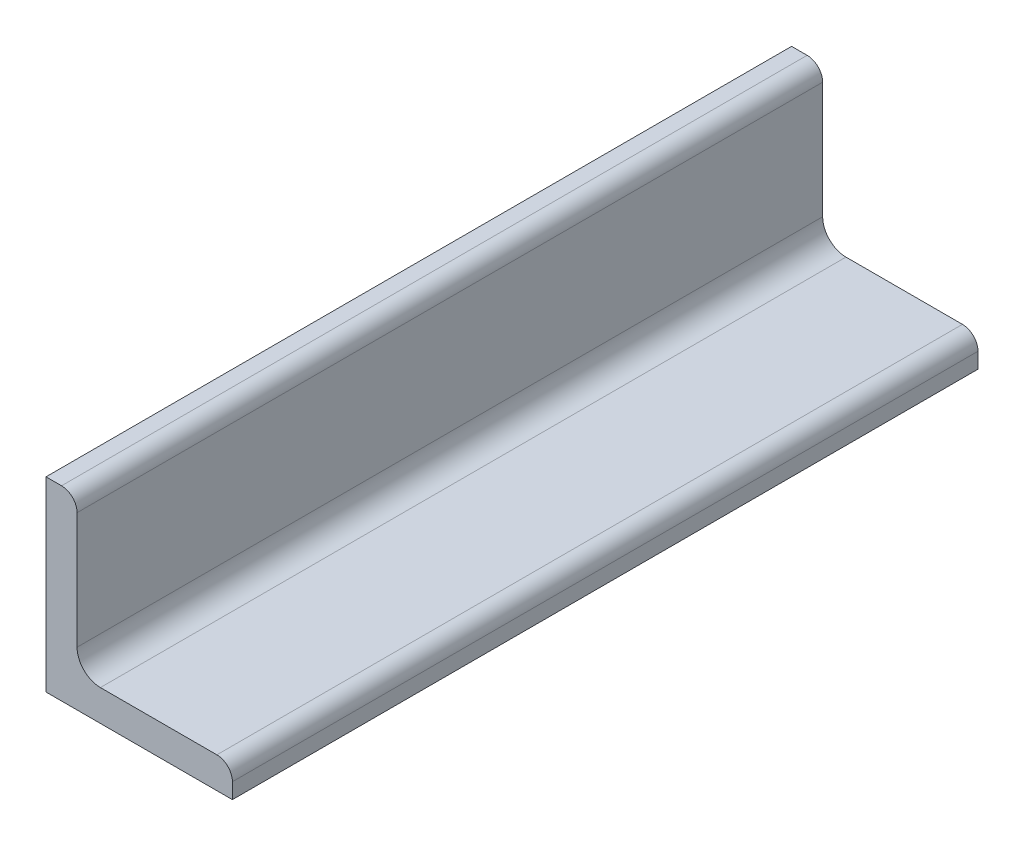
ISO-10303-21;
HEADER;
FILE_DESCRIPTION(('STEP AP214'),'2;1');
FILE_NAME('part.step','',(''),(''),'','','');
FILE_SCHEMA(('AUTOMOTIVE_DESIGN { 1 0 10303 214 1 1 1 1 }'));
ENDSEC;
DATA;
#1=APPLICATION_CONTEXT('core data for automotive mechanical design processes');
#2=APPLICATION_PROTOCOL_DEFINITION('international standard','automotive_design',2000,#1);
#3=PRODUCT_CONTEXT('',#1,'mechanical');
#4=PRODUCT('Part','Part','',(#3));
#5=PRODUCT_RELATED_PRODUCT_CATEGORY('part','',(#4));
#6=PRODUCT_DEFINITION_FORMATION('','',#4);
#7=PRODUCT_DEFINITION_CONTEXT('part definition',#1,'design');
#8=PRODUCT_DEFINITION('design','',#6,#7);
#9=PRODUCT_DEFINITION_SHAPE('','',#8);
#10=(LENGTH_UNIT() NAMED_UNIT(*) SI_UNIT(.MILLI.,.METRE.));
#11=(NAMED_UNIT(*) PLANE_ANGLE_UNIT() SI_UNIT($,.RADIAN.));
#12=(NAMED_UNIT(*) SI_UNIT($,.STERADIAN.) SOLID_ANGLE_UNIT());
#13=UNCERTAINTY_MEASURE_WITH_UNIT(LENGTH_MEASURE(1.E-05),#10,'distance_accuracy_value','');
#14=(GEOMETRIC_REPRESENTATION_CONTEXT(3) GLOBAL_UNCERTAINTY_ASSIGNED_CONTEXT((#13)) GLOBAL_UNIT_ASSIGNED_CONTEXT((#10,
#11,#12)) REPRESENTATION_CONTEXT('',''));
#15=CARTESIAN_POINT('',(0.,0.,0.));
#16=DIRECTION('',(0.,0.,1.));
#17=DIRECTION('',(1.,0.,0.));
#18=AXIS2_PLACEMENT_3D('',#15,#16,#17);
#19=CARTESIAN_POINT('',(0.490776827053332,76.2882459217981,304.8));
#20=DIRECTION('',(1.,0.,0.));
#21=DIRECTION('',(0.,0.,-1.));
#22=AXIS2_PLACEMENT_3D('',#19,#20,#21);
#23=PLANE('',#22);
#24=DIRECTION('',(0.,-1.,0.));
#25=VECTOR('',#24,1.);
#26=CARTESIAN_POINT('',(0.490776827053332,76.2882459217981,0.));
#27=LINE('',#26,#25);
#28=CARTESIAN_POINT('',(0.490776827053332,76.2882459217981,0.));
#29=VERTEX_POINT('',#28);
#30=CARTESIAN_POINT('',(0.490776827053332,0.0882459217980795,0.));
#31=VERTEX_POINT('',#30);
#32=EDGE_CURVE('E135',#29,#31,#27,.T.);
#33=ORIENTED_EDGE('',*,*,#32,.T.);
#34=DIRECTION('',(0.,0.,-1.));
#35=VECTOR('',#34,1.);
#36=CARTESIAN_POINT('',(0.490776827053332,0.0882459217980795,304.8));
#37=LINE('',#36,#35);
#38=CARTESIAN_POINT('',(0.490776827053332,0.0882459217980795,304.8));
#39=VERTEX_POINT('',#38);
#40=EDGE_CURVE('E11',#39,#31,#37,.T.);
#41=ORIENTED_EDGE('',*,*,#40,.F.);
#42=DIRECTION('',(0.,-1.,0.));
#43=VECTOR('',#42,1.);
#44=CARTESIAN_POINT('',(0.490776827053332,76.2882459217981,304.8));
#45=LINE('',#44,#43);
#46=CARTESIAN_POINT('',(0.490776827053332,76.2882459217981,304.8));
#47=VERTEX_POINT('',#46);
#48=EDGE_CURVE('E151',#47,#39,#45,.T.);
#49=ORIENTED_EDGE('',*,*,#48,.F.);
#50=DIRECTION('',(0.,0.,-1.));
#51=VECTOR('',#50,1.);
#52=CARTESIAN_POINT('',(0.490776827053332,76.2882459217981,304.8));
#53=LINE('',#52,#51);
#54=EDGE_CURVE('E131',#47,#29,#53,.T.);
#55=ORIENTED_EDGE('',*,*,#54,.T.);
#56=EDGE_LOOP('',(#33,#41,#49,#55));
#57=FACE_BOUND('',#56,.T.);
#58=ADVANCED_FACE('F33',(#57),#23,.F.);
#59=CARTESIAN_POINT('',(0.490776827053332,0.0882459217980795,304.8));
#60=DIRECTION('',(0.,1.,0.));
#61=DIRECTION('',(0.,0.,1.));
#62=AXIS2_PLACEMENT_3D('',#59,#60,#61);
#63=PLANE('',#62);
#64=DIRECTION('',(1.,0.,0.));
#65=VECTOR('',#64,1.);
#66=CARTESIAN_POINT('',(0.490776827053332,0.0882459217980795,0.));
#67=LINE('',#66,#65);
#68=CARTESIAN_POINT('',(76.6907768270533,0.0882459217980795,0.));
#69=VERTEX_POINT('',#68);
#70=EDGE_CURVE('E138',#31,#69,#67,.T.);
#71=ORIENTED_EDGE('',*,*,#70,.T.);
#72=DIRECTION('',(0.,0.,-1.));
#73=VECTOR('',#72,1.);
#74=CARTESIAN_POINT('',(76.6907768270533,0.0882459217980795,304.8));
#75=LINE('',#74,#73);
#76=CARTESIAN_POINT('',(76.6907768270533,0.0882459217980795,304.8));
#77=VERTEX_POINT('',#76);
#78=EDGE_CURVE('E41',#77,#69,#75,.T.);
#79=ORIENTED_EDGE('',*,*,#78,.F.);
#80=DIRECTION('',(1.,0.,0.));
#81=VECTOR('',#80,1.);
#82=CARTESIAN_POINT('',(0.490776827053332,0.0882459217980795,304.8));
#83=LINE('',#82,#81);
#84=EDGE_CURVE('E95',#39,#77,#83,.T.);
#85=ORIENTED_EDGE('',*,*,#84,.F.);
#86=ORIENTED_EDGE('',*,*,#40,.T.);
#87=EDGE_LOOP('',(#71,#79,#85,#86));
#88=FACE_BOUND('',#87,.T.);
#89=ADVANCED_FACE('F194',(#88),#63,.F.);
#90=CARTESIAN_POINT('',(76.6907768270533,0.0882459217980795,304.8));
#91=DIRECTION('',(-1.,0.,0.));
#92=DIRECTION('',(0.,0.,1.));
#93=AXIS2_PLACEMENT_3D('',#90,#91,#92);
#94=PLANE('',#93);
#95=DIRECTION('',(0.,1.,0.));
#96=VECTOR('',#95,1.);
#97=CARTESIAN_POINT('',(76.6907768270533,0.0882459217980795,0.));
#98=LINE('',#97,#96);
#99=CARTESIAN_POINT('',(76.6907768270533,6.43824592179808,0.));
#100=VERTEX_POINT('',#99);
#101=EDGE_CURVE('E140',#69,#100,#98,.T.);
#102=ORIENTED_EDGE('',*,*,#101,.T.);
#103=DIRECTION('',(0.,0.,-1.));
#104=VECTOR('',#103,1.);
#105=CARTESIAN_POINT('',(76.6907768270533,6.43824592179808,304.8));
#106=LINE('',#105,#104);
#107=CARTESIAN_POINT('',(76.6907768270533,6.43824592179808,304.8));
#108=VERTEX_POINT('',#107);
#109=EDGE_CURVE('E161',#108,#100,#106,.T.);
#110=ORIENTED_EDGE('',*,*,#109,.F.);
#111=DIRECTION('',(0.,1.,0.));
#112=VECTOR('',#111,1.);
#113=CARTESIAN_POINT('',(76.6907768270533,0.0882459217980795,304.8));
#114=LINE('',#113,#112);
#115=EDGE_CURVE('E169',#77,#108,#114,.T.);
#116=ORIENTED_EDGE('',*,*,#115,.F.);
#117=ORIENTED_EDGE('',*,*,#78,.T.);
#118=EDGE_LOOP('',(#102,#110,#116,#117));
#119=FACE_BOUND('',#118,.T.);
#120=ADVANCED_FACE('F167',(#119),#94,.F.);
#121=CARTESIAN_POINT('',(70.3407768270533,6.43824592179808,304.8));
#122=DIRECTION('',(0.,0.,-1.));
#123=DIRECTION('',(-1.,0.,0.));
#124=AXIS2_PLACEMENT_3D('',#121,#122,#123);
#125=CYLINDRICAL_SURFACE('',#124,6.35000000000001);
#126=CARTESIAN_POINT('',(70.3407768270533,6.43824592179808,0.));
#127=DIRECTION('',(0.,0.,1.));
#128=DIRECTION('',(1.,0.,0.));
#129=AXIS2_PLACEMENT_3D('',#126,#127,#128);
#130=CIRCLE('',#129,6.35000000000001);
#131=CARTESIAN_POINT('',(70.3407768270533,12.7882459217981,0.));
#132=VERTEX_POINT('',#131);
#133=EDGE_CURVE('E142',#100,#132,#130,.T.);
#134=ORIENTED_EDGE('',*,*,#133,.T.);
#135=DIRECTION('',(0.,0.,-1.));
#136=VECTOR('',#135,1.);
#137=CARTESIAN_POINT('',(70.3407768270533,12.7882459217981,304.8));
#138=LINE('',#137,#136);
#139=CARTESIAN_POINT('',(70.3407768270533,12.7882459217981,304.8));
#140=VERTEX_POINT('',#139);
#141=EDGE_CURVE('E158',#140,#132,#138,.T.);
#142=ORIENTED_EDGE('',*,*,#141,.F.);
#143=CARTESIAN_POINT('',(70.3407768270533,6.43824592179808,304.8));
#144=DIRECTION('',(0.,0.,1.));
#145=DIRECTION('',(1.,0.,0.));
#146=AXIS2_PLACEMENT_3D('',#143,#144,#145);
#147=CIRCLE('',#146,6.35000000000001);
#148=EDGE_CURVE('E185',#108,#140,#147,.T.);
#149=ORIENTED_EDGE('',*,*,#148,.F.);
#150=ORIENTED_EDGE('',*,*,#109,.T.);
#151=EDGE_LOOP('',(#134,#142,#149,#150));
#152=FACE_BOUND('',#151,.T.);
#153=ADVANCED_FACE('F178',(#152),#125,.T.);
#154=CARTESIAN_POINT('',(70.3407768270533,12.7882459217981,304.8));
#155=DIRECTION('',(0.,-1.,0.));
#156=DIRECTION('',(0.,0.,-1.));
#157=AXIS2_PLACEMENT_3D('',#154,#155,#156);
#158=PLANE('',#157);
#159=DIRECTION('',(-1.,0.,0.));
#160=VECTOR('',#159,1.);
#161=CARTESIAN_POINT('',(70.3407768270533,12.7882459217981,0.));
#162=LINE('',#161,#160);
#163=CARTESIAN_POINT('',(22.7157768270533,12.7882459217981,0.));
#164=VERTEX_POINT('',#163);
#165=EDGE_CURVE('E144',#132,#164,#162,.T.);
#166=ORIENTED_EDGE('',*,*,#165,.T.);
#167=DIRECTION('',(0.,0.,-1.));
#168=VECTOR('',#167,1.);
#169=CARTESIAN_POINT('',(22.7157768270533,12.7882459217981,304.8));
#170=LINE('',#169,#168);
#171=CARTESIAN_POINT('',(22.7157768270533,12.7882459217981,304.8));
#172=VERTEX_POINT('',#171);
#173=EDGE_CURVE('E155',#172,#164,#170,.T.);
#174=ORIENTED_EDGE('',*,*,#173,.F.);
#175=DIRECTION('',(-1.,0.,0.));
#176=VECTOR('',#175,1.);
#177=CARTESIAN_POINT('',(70.3407768270533,12.7882459217981,304.8));
#178=LINE('',#177,#176);
#179=EDGE_CURVE('E184',#140,#172,#178,.T.);
#180=ORIENTED_EDGE('',*,*,#179,.F.);
#181=ORIENTED_EDGE('',*,*,#141,.T.);
#182=EDGE_LOOP('',(#166,#174,#180,#181));
#183=FACE_BOUND('',#182,.T.);
#184=ADVANCED_FACE('F182',(#183),#158,.F.);
#185=CARTESIAN_POINT('',(22.7157768270533,22.3132459217981,304.8));
#186=DIRECTION('',(0.,0.,-1.));
#187=DIRECTION('',(-1.,0.,0.));
#188=AXIS2_PLACEMENT_3D('',#185,#186,#187);
#189=CYLINDRICAL_SURFACE('',#188,9.52499999999999);
#190=CARTESIAN_POINT('',(22.7157768270533,22.3132459217981,0.));
#191=DIRECTION('',(0.,0.,-1.));
#192=DIRECTION('',(1.,0.,0.));
#193=AXIS2_PLACEMENT_3D('',#190,#191,#192);
#194=CIRCLE('',#193,9.52499999999999);
#195=CARTESIAN_POINT('',(13.1907768270533,22.3132459217981,0.));
#196=VERTEX_POINT('',#195);
#197=EDGE_CURVE('E146',#164,#196,#194,.T.);
#198=ORIENTED_EDGE('',*,*,#197,.T.);
#199=DIRECTION('',(0.,0.,-1.));
#200=VECTOR('',#199,1.);
#201=CARTESIAN_POINT('',(13.1907768270533,22.3132459217981,304.8));
#202=LINE('',#201,#200);
#203=CARTESIAN_POINT('',(13.1907768270533,22.3132459217981,304.8));
#204=VERTEX_POINT('',#203);
#205=EDGE_CURVE('E126',#204,#196,#202,.T.);
#206=ORIENTED_EDGE('',*,*,#205,.F.);
#207=CARTESIAN_POINT('',(22.7157768270533,22.3132459217981,304.8));
#208=DIRECTION('',(0.,0.,-1.));
#209=DIRECTION('',(1.,0.,0.));
#210=AXIS2_PLACEMENT_3D('',#207,#208,#209);
#211=CIRCLE('',#210,9.52499999999999);
#212=EDGE_CURVE('E117',#172,#204,#211,.T.);
#213=ORIENTED_EDGE('',*,*,#212,.F.);
#214=ORIENTED_EDGE('',*,*,#173,.T.);
#215=EDGE_LOOP('',(#198,#206,#213,#214));
#216=FACE_BOUND('',#215,.T.);
#217=ADVANCED_FACE('F206',(#216),#189,.F.);
#218=CARTESIAN_POINT('',(13.1907768270533,22.3132459217981,304.8));
#219=DIRECTION('',(-1.,0.,0.));
#220=DIRECTION('',(0.,0.,1.));
#221=AXIS2_PLACEMENT_3D('',#218,#219,#220);
#222=PLANE('',#221);
#223=DIRECTION('',(0.,1.,0.));
#224=VECTOR('',#223,1.);
#225=CARTESIAN_POINT('',(13.1907768270533,22.3132459217981,0.));
#226=LINE('',#225,#224);
#227=CARTESIAN_POINT('',(13.1907768270533,69.9382459217981,0.));
#228=VERTEX_POINT('',#227);
#229=EDGE_CURVE('E125',#196,#228,#226,.T.);
#230=ORIENTED_EDGE('',*,*,#229,.T.);
#231=DIRECTION('',(0.,0.,-1.));
#232=VECTOR('',#231,1.);
#233=CARTESIAN_POINT('',(13.1907768270533,69.9382459217981,304.8));
#234=LINE('',#233,#232);
#235=CARTESIAN_POINT('',(13.1907768270533,69.9382459217981,304.8));
#236=VERTEX_POINT('',#235);
#237=EDGE_CURVE('E122',#236,#228,#234,.T.);
#238=ORIENTED_EDGE('',*,*,#237,.F.);
#239=DIRECTION('',(0.,1.,0.));
#240=VECTOR('',#239,1.);
#241=CARTESIAN_POINT('',(13.1907768270533,22.3132459217981,304.8));
#242=LINE('',#241,#240);
#243=EDGE_CURVE('E111',#204,#236,#242,.T.);
#244=ORIENTED_EDGE('',*,*,#243,.F.);
#245=ORIENTED_EDGE('',*,*,#205,.T.);
#246=EDGE_LOOP('',(#230,#238,#244,#245));
#247=FACE_BOUND('',#246,.T.);
#248=ADVANCED_FACE('F123',(#247),#222,.F.);
#249=CARTESIAN_POINT('',(6.84077682705333,69.9382459217981,304.8));
#250=DIRECTION('',(0.,0.,-1.));
#251=DIRECTION('',(-1.,0.,0.));
#252=AXIS2_PLACEMENT_3D('',#249,#250,#251);
#253=CYLINDRICAL_SURFACE('',#252,6.35);
#254=CARTESIAN_POINT('',(6.84077682705333,69.9382459217981,0.));
#255=DIRECTION('',(0.,0.,1.));
#256=DIRECTION('',(1.,0.,0.));
#257=AXIS2_PLACEMENT_3D('',#254,#255,#256);
#258=CIRCLE('',#257,6.35);
#259=CARTESIAN_POINT('',(6.84077682705333,76.2882459217981,0.));
#260=VERTEX_POINT('',#259);
#261=EDGE_CURVE('E81',#228,#260,#258,.T.);
#262=ORIENTED_EDGE('',*,*,#261,.T.);
#263=DIRECTION('',(0.,0.,-1.));
#264=VECTOR('',#263,1.);
#265=CARTESIAN_POINT('',(6.84077682705333,76.2882459217981,304.8));
#266=LINE('',#265,#264);
#267=CARTESIAN_POINT('',(6.84077682705333,76.2882459217981,304.8));
#268=VERTEX_POINT('',#267);
#269=EDGE_CURVE('E127',#268,#260,#266,.T.);
#270=ORIENTED_EDGE('',*,*,#269,.F.);
#271=CARTESIAN_POINT('',(6.84077682705333,69.9382459217981,304.8));
#272=DIRECTION('',(0.,0.,1.));
#273=DIRECTION('',(1.,0.,0.));
#274=AXIS2_PLACEMENT_3D('',#271,#272,#273);
#275=CIRCLE('',#274,6.35);
#276=EDGE_CURVE('E115',#236,#268,#275,.T.);
#277=ORIENTED_EDGE('',*,*,#276,.F.);
#278=ORIENTED_EDGE('',*,*,#237,.T.);
#279=EDGE_LOOP('',(#262,#270,#277,#278));
#280=FACE_BOUND('',#279,.T.);
#281=ADVANCED_FACE('F129',(#280),#253,.T.);
#282=CARTESIAN_POINT('',(6.84077682705333,76.2882459217981,304.8));
#283=DIRECTION('',(0.,-1.,0.));
#284=DIRECTION('',(0.,0.,-1.));
#285=AXIS2_PLACEMENT_3D('',#282,#283,#284);
#286=PLANE('',#285);
#287=DIRECTION('',(-1.,0.,0.));
#288=VECTOR('',#287,1.);
#289=CARTESIAN_POINT('',(6.84077682705333,76.2882459217981,0.));
#290=LINE('',#289,#288);
#291=EDGE_CURVE('E87',#260,#29,#290,.T.);
#292=ORIENTED_EDGE('',*,*,#291,.T.);
#293=ORIENTED_EDGE('',*,*,#54,.F.);
#294=DIRECTION('',(-1.,0.,0.));
#295=VECTOR('',#294,1.);
#296=CARTESIAN_POINT('',(6.84077682705333,76.2882459217981,304.8));
#297=LINE('',#296,#295);
#298=EDGE_CURVE('E49',#268,#47,#297,.T.);
#299=ORIENTED_EDGE('',*,*,#298,.F.);
#300=ORIENTED_EDGE('',*,*,#269,.T.);
#301=EDGE_LOOP('',(#292,#293,#299,#300));
#302=FACE_BOUND('',#301,.T.);
#303=ADVANCED_FACE('F214',(#302),#286,.F.);
#304=CARTESIAN_POINT('',(70.3407768270533,6.43824592179808,304.8));
#305=DIRECTION('',(0.,0.,1.));
#306=DIRECTION('',(1.,0.,0.));
#307=AXIS2_PLACEMENT_3D('',#304,#305,#306);
#308=PLANE('',#307);
#309=ORIENTED_EDGE('',*,*,#48,.T.);
#310=ORIENTED_EDGE('',*,*,#84,.T.);
#311=ORIENTED_EDGE('',*,*,#115,.T.);
#312=ORIENTED_EDGE('',*,*,#148,.T.);
#313=ORIENTED_EDGE('',*,*,#179,.T.);
#314=ORIENTED_EDGE('',*,*,#212,.T.);
#315=ORIENTED_EDGE('',*,*,#243,.T.);
#316=ORIENTED_EDGE('',*,*,#276,.T.);
#317=ORIENTED_EDGE('',*,*,#298,.T.);
#318=EDGE_LOOP('',(#309,#310,#311,#312,#313,#314,#315,#316,#317));
#319=FACE_BOUND('',#318,.T.);
#320=ADVANCED_FACE('F113',(#319),#308,.T.);
#321=CARTESIAN_POINT('',(70.3407768270533,6.43824592179808,0.));
#322=DIRECTION('',(0.,0.,1.));
#323=DIRECTION('',(1.,0.,0.));
#324=AXIS2_PLACEMENT_3D('',#321,#322,#323);
#325=PLANE('',#324);
#326=ORIENTED_EDGE('',*,*,#32,.F.);
#327=ORIENTED_EDGE('',*,*,#291,.F.);
#328=ORIENTED_EDGE('',*,*,#261,.F.);
#329=ORIENTED_EDGE('',*,*,#229,.F.);
#330=ORIENTED_EDGE('',*,*,#197,.F.);
#331=ORIENTED_EDGE('',*,*,#165,.F.);
#332=ORIENTED_EDGE('',*,*,#133,.F.);
#333=ORIENTED_EDGE('',*,*,#101,.F.);
#334=ORIENTED_EDGE('',*,*,#70,.F.);
#335=EDGE_LOOP('',(#326,#327,#328,#329,#330,#331,#332,#333,#334));
#336=FACE_BOUND('',#335,.T.);
#337=ADVANCED_FACE('F173',(#336),#325,.F.);
#338=CLOSED_SHELL('',(#58,#89,#120,#153,#184,#217,#248,#281,#303,#320,#337));
#339=MANIFOLD_SOLID_BREP('B2',#338);
#340=ADVANCED_BREP_SHAPE_REPRESENTATION('',(#18,#339),#14);
#341=SHAPE_DEFINITION_REPRESENTATION(#9,#340);
ENDSEC;
END-ISO-10303-21;
